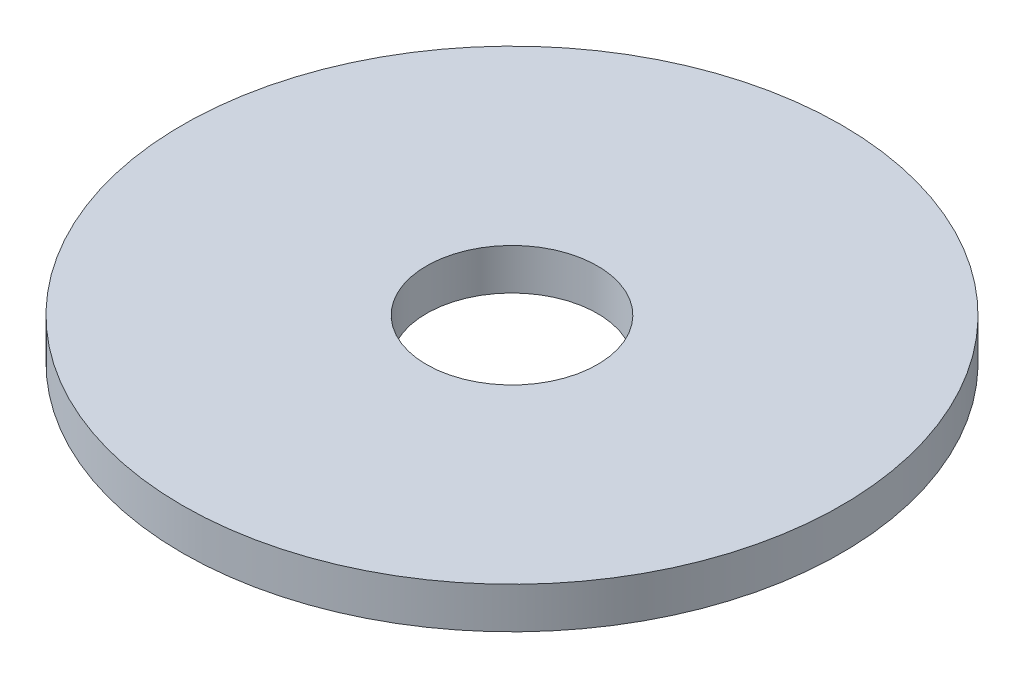
ISO-10303-21;
HEADER;
FILE_DESCRIPTION(('STEP AP214'),'2;1');
FILE_NAME('part.step','',(''),(''),'','','');
FILE_SCHEMA(('AUTOMOTIVE_DESIGN { 1 0 10303 214 1 1 1 1 }'));
ENDSEC;
DATA;
#1=APPLICATION_CONTEXT('core data for automotive mechanical design processes');
#2=APPLICATION_PROTOCOL_DEFINITION('international standard','automotive_design',2000,#1);
#3=PRODUCT_CONTEXT('',#1,'mechanical');
#4=PRODUCT('Part','Part','',(#3));
#5=PRODUCT_RELATED_PRODUCT_CATEGORY('part','',(#4));
#6=PRODUCT_DEFINITION_FORMATION('','',#4);
#7=PRODUCT_DEFINITION_CONTEXT('part definition',#1,'design');
#8=PRODUCT_DEFINITION('design','',#6,#7);
#9=PRODUCT_DEFINITION_SHAPE('','',#8);
#10=(LENGTH_UNIT() NAMED_UNIT(*) SI_UNIT(.MILLI.,.METRE.));
#11=(NAMED_UNIT(*) PLANE_ANGLE_UNIT() SI_UNIT($,.RADIAN.));
#12=(NAMED_UNIT(*) SI_UNIT($,.STERADIAN.) SOLID_ANGLE_UNIT());
#13=UNCERTAINTY_MEASURE_WITH_UNIT(LENGTH_MEASURE(1.E-05),#10,'distance_accuracy_value','');
#14=(GEOMETRIC_REPRESENTATION_CONTEXT(3) GLOBAL_UNCERTAINTY_ASSIGNED_CONTEXT((#13)) GLOBAL_UNIT_ASSIGNED_CONTEXT((#10,
#11,#12)) REPRESENTATION_CONTEXT('',''));
#15=CARTESIAN_POINT('',(0.,0.,0.));
#16=DIRECTION('',(0.,0.,1.));
#17=DIRECTION('',(1.,0.,0.));
#18=AXIS2_PLACEMENT_3D('',#15,#16,#17);
#19=CARTESIAN_POINT('',(0.,2.,0.));
#20=DIRECTION('',(0.,1.,0.));
#21=DIRECTION('',(0.,0.,1.));
#22=AXIS2_PLACEMENT_3D('',#19,#20,#21);
#23=PLANE('',#22);
#24=CARTESIAN_POINT('',(0.,2.,0.));
#25=DIRECTION('',(0.,1.,0.));
#26=DIRECTION('',(0.,0.,1.));
#27=AXIS2_PLACEMENT_3D('',#24,#25,#26);
#28=CIRCLE('',#27,16.);
#29=CARTESIAN_POINT('',(0.,2.,16.));
#30=VERTEX_POINT('',#29);
#31=EDGE_CURVE('E10',#30,#30,#28,.T.);
#32=ORIENTED_EDGE('',*,*,#31,.T.);
#33=EDGE_LOOP('',(#32));
#34=FACE_BOUND('',#33,.T.);
#35=CARTESIAN_POINT('',(0.,2.,0.));
#36=DIRECTION('',(0.,1.,0.));
#37=DIRECTION('',(0.,0.,1.));
#38=AXIS2_PLACEMENT_3D('',#35,#36,#37);
#39=CIRCLE('',#38,4.15);
#40=CARTESIAN_POINT('',(0.,2.,4.15));
#41=VERTEX_POINT('',#40);
#42=EDGE_CURVE('E48',#41,#41,#39,.T.);
#43=ORIENTED_EDGE('',*,*,#42,.F.);
#44=EDGE_LOOP('',(#43));
#45=FACE_BOUND('',#44,.T.);
#46=ADVANCED_FACE('F37',(#34,#45),#23,.T.);
#47=CARTESIAN_POINT('',(0.,0.,0.));
#48=DIRECTION('',(0.,1.,0.));
#49=DIRECTION('',(0.,0.,1.));
#50=AXIS2_PLACEMENT_3D('',#47,#48,#49);
#51=PLANE('',#50);
#52=CARTESIAN_POINT('',(0.,0.,0.));
#53=DIRECTION('',(0.,1.,0.));
#54=DIRECTION('',(0.,0.,1.));
#55=AXIS2_PLACEMENT_3D('',#52,#53,#54);
#56=CIRCLE('',#55,16.);
#57=CARTESIAN_POINT('',(0.,0.,16.));
#58=VERTEX_POINT('',#57);
#59=EDGE_CURVE('E41',#58,#58,#56,.T.);
#60=ORIENTED_EDGE('',*,*,#59,.F.);
#61=EDGE_LOOP('',(#60));
#62=FACE_BOUND('',#61,.T.);
#63=CARTESIAN_POINT('',(0.,0.,0.));
#64=DIRECTION('',(0.,1.,0.));
#65=DIRECTION('',(0.,0.,1.));
#66=AXIS2_PLACEMENT_3D('',#63,#64,#65);
#67=CIRCLE('',#66,4.15);
#68=CARTESIAN_POINT('',(0.,0.,4.15));
#69=VERTEX_POINT('',#68);
#70=EDGE_CURVE('E50',#69,#69,#67,.T.);
#71=ORIENTED_EDGE('',*,*,#70,.T.);
#72=EDGE_LOOP('',(#71));
#73=FACE_BOUND('',#72,.T.);
#74=ADVANCED_FACE('F60',(#62,#73),#51,.F.);
#75=CARTESIAN_POINT('',(0.,2.,0.));
#76=DIRECTION('',(0.,-1.,0.));
#77=DIRECTION('',(0.,0.,-1.));
#78=AXIS2_PLACEMENT_3D('',#75,#76,#77);
#79=CYLINDRICAL_SURFACE('',#78,16.);
#80=ORIENTED_EDGE('',*,*,#31,.F.);
#81=EDGE_LOOP('',(#80));
#82=FACE_BOUND('',#81,.T.);
#83=ORIENTED_EDGE('',*,*,#59,.T.);
#84=EDGE_LOOP('',(#83));
#85=FACE_BOUND('',#84,.T.);
#86=ADVANCED_FACE('F39',(#82,#85),#79,.T.);
#87=CARTESIAN_POINT('',(0.,2.,0.));
#88=DIRECTION('',(0.,-1.,0.));
#89=DIRECTION('',(0.,0.,-1.));
#90=AXIS2_PLACEMENT_3D('',#87,#88,#89);
#91=CYLINDRICAL_SURFACE('',#90,4.15);
#92=ORIENTED_EDGE('',*,*,#42,.T.);
#93=EDGE_LOOP('',(#92));
#94=FACE_BOUND('',#93,.T.);
#95=ORIENTED_EDGE('',*,*,#70,.F.);
#96=EDGE_LOOP('',(#95));
#97=FACE_BOUND('',#96,.T.);
#98=ADVANCED_FACE('F56',(#94,#97),#91,.F.);
#99=CLOSED_SHELL('',(#46,#74,#86,#98));
#100=MANIFOLD_SOLID_BREP('B2',#99);
#101=ADVANCED_BREP_SHAPE_REPRESENTATION('',(#18,#100),#14);
#102=SHAPE_DEFINITION_REPRESENTATION(#9,#101);
ENDSEC;
END-ISO-10303-21;
